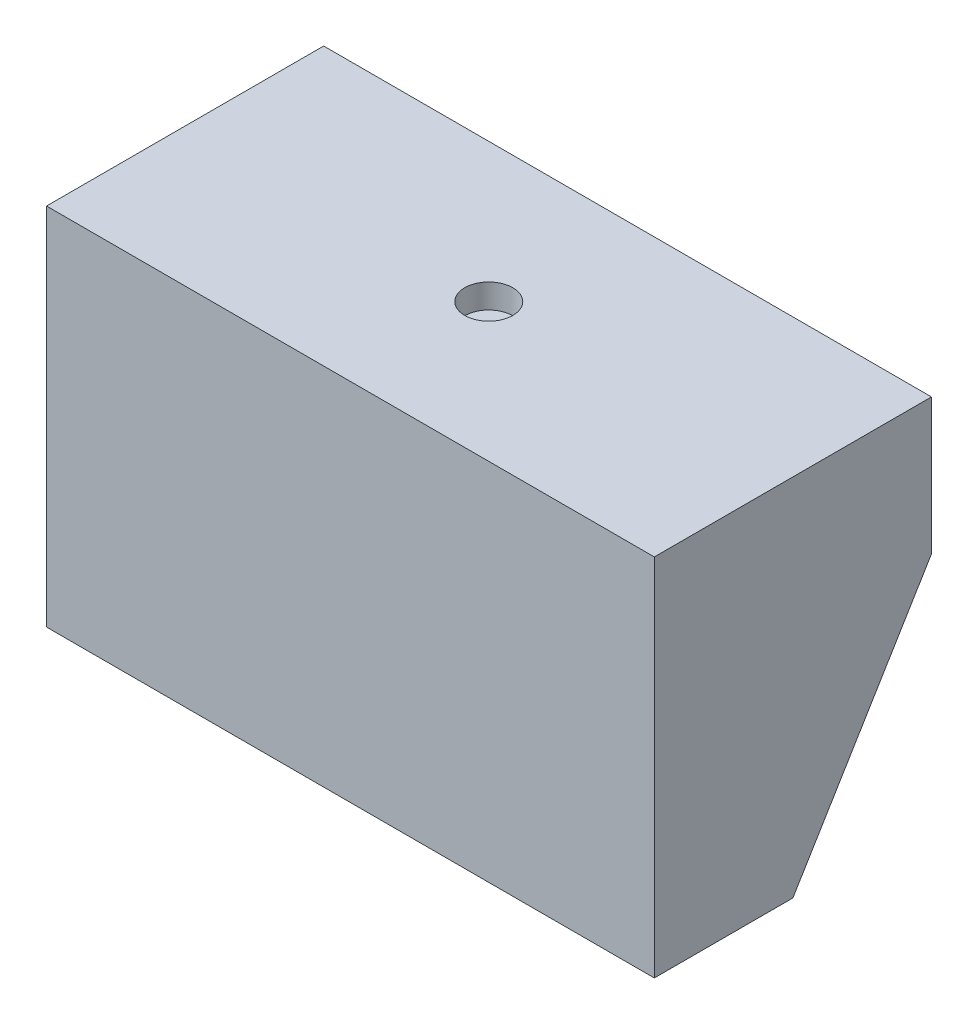
ISO-10303-21;
HEADER;
FILE_DESCRIPTION(('STEP AP214'),'2;1');
FILE_NAME('part.step','',(''),(''),'','','');
FILE_SCHEMA(('AUTOMOTIVE_DESIGN { 1 0 10303 214 1 1 1 1 }'));
ENDSEC;
DATA;
#1=APPLICATION_CONTEXT('core data for automotive mechanical design processes');
#2=APPLICATION_PROTOCOL_DEFINITION('international standard','automotive_design',2000,#1);
#3=PRODUCT_CONTEXT('',#1,'mechanical');
#4=PRODUCT('Part','Part','',(#3));
#5=PRODUCT_RELATED_PRODUCT_CATEGORY('part','',(#4));
#6=PRODUCT_DEFINITION_FORMATION('','',#4);
#7=PRODUCT_DEFINITION_CONTEXT('part definition',#1,'design');
#8=PRODUCT_DEFINITION('design','',#6,#7);
#9=PRODUCT_DEFINITION_SHAPE('','',#8);
#10=(LENGTH_UNIT() NAMED_UNIT(*) SI_UNIT(.MILLI.,.METRE.));
#11=(NAMED_UNIT(*) PLANE_ANGLE_UNIT() SI_UNIT($,.RADIAN.));
#12=(NAMED_UNIT(*) SI_UNIT($,.STERADIAN.) SOLID_ANGLE_UNIT());
#13=UNCERTAINTY_MEASURE_WITH_UNIT(LENGTH_MEASURE(1.E-05),#10,'distance_accuracy_value','');
#14=(GEOMETRIC_REPRESENTATION_CONTEXT(3) GLOBAL_UNCERTAINTY_ASSIGNED_CONTEXT((#13)) GLOBAL_UNIT_ASSIGNED_CONTEXT((#10,
#11,#12)) REPRESENTATION_CONTEXT('',''));
#15=CARTESIAN_POINT('',(0.,0.,0.));
#16=DIRECTION('',(0.,0.,1.));
#17=DIRECTION('',(1.,0.,0.));
#18=AXIS2_PLACEMENT_3D('',#15,#16,#17);
#19=CARTESIAN_POINT('',(125.,-75.,114.));
#20=DIRECTION('',(-1.,0.,0.));
#21=DIRECTION('',(0.,0.,1.));
#22=AXIS2_PLACEMENT_3D('',#19,#20,#21);
#23=PLANE('',#22);
#24=DIRECTION('',(0.,-0.855226725322334,0.518254038377355));
#25=VECTOR('',#24,1.);
#26=CARTESIAN_POINT('',(125.,-100.263808135213,72.3094731527829));
#27=LINE('',#26,#25);
#28=CARTESIAN_POINT('',(125.,19.0618301711685,0.));
#29=VERTEX_POINT('',#28);
#30=CARTESIAN_POINT('',(125.,-75.,56.9999999999999));
#31=VERTEX_POINT('',#30);
#32=EDGE_CURVE('E117',#29,#31,#27,.T.);
#33=ORIENTED_EDGE('',*,*,#32,.F.);
#34=DIRECTION('',(0.,1.,0.));
#35=VECTOR('',#34,1.);
#36=CARTESIAN_POINT('',(125.,-75.,0.));
#37=LINE('',#36,#35);
#38=CARTESIAN_POINT('',(125.,75.,0.));
#39=VERTEX_POINT('',#38);
#40=EDGE_CURVE('E125',#29,#39,#37,.T.);
#41=ORIENTED_EDGE('',*,*,#40,.T.);
#42=DIRECTION('',(0.,0.,-1.));
#43=VECTOR('',#42,1.);
#44=CARTESIAN_POINT('',(125.,75.,114.));
#45=LINE('',#44,#43);
#46=CARTESIAN_POINT('',(125.,75.,114.));
#47=VERTEX_POINT('',#46);
#48=EDGE_CURVE('E53',#47,#39,#45,.T.);
#49=ORIENTED_EDGE('',*,*,#48,.F.);
#50=DIRECTION('',(0.,1.,0.));
#51=VECTOR('',#50,1.);
#52=CARTESIAN_POINT('',(125.,-75.,114.));
#53=LINE('',#52,#51);
#54=CARTESIAN_POINT('',(125.,-75.,114.));
#55=VERTEX_POINT('',#54);
#56=EDGE_CURVE('E149',#55,#47,#53,.T.);
#57=ORIENTED_EDGE('',*,*,#56,.F.);
#58=DIRECTION('',(0.,0.,-1.));
#59=VECTOR('',#58,1.);
#60=CARTESIAN_POINT('',(125.,-75.,114.));
#61=LINE('',#60,#59);
#62=EDGE_CURVE('E128',#55,#31,#61,.T.);
#63=ORIENTED_EDGE('',*,*,#62,.T.);
#64=EDGE_LOOP('',(#33,#41,#49,#57,#63));
#65=FACE_BOUND('',#64,.T.);
#66=ADVANCED_FACE('F45',(#65),#23,.F.);
#67=CARTESIAN_POINT('',(-125.,-75.,114.));
#68=DIRECTION('',(0.,1.,0.));
#69=DIRECTION('',(0.,0.,1.));
#70=AXIS2_PLACEMENT_3D('',#67,#68,#69);
#71=PLANE('',#70);
#72=DIRECTION('',(-0.823397266330031,0.,-0.567465366168044));
#73=VECTOR('',#72,1.);
#74=CARTESIAN_POINT('',(-17.862546969277,-75.,-41.4573921273211));
#75=LINE('',#74,#73);
#76=CARTESIAN_POINT('',(42.292495755744,-75.,0.));
#77=VERTEX_POINT('',#76);
#78=EDGE_CURVE('E64',#31,#77,#75,.T.);
#79=ORIENTED_EDGE('',*,*,#78,.F.);
#80=ORIENTED_EDGE('',*,*,#62,.F.);
#81=DIRECTION('',(1.,0.,0.));
#82=VECTOR('',#81,1.);
#83=CARTESIAN_POINT('',(-125.,-75.,114.));
#84=LINE('',#83,#82);
#85=CARTESIAN_POINT('',(-125.,-75.,114.));
#86=VERTEX_POINT('',#85);
#87=EDGE_CURVE('E74',#86,#55,#84,.T.);
#88=ORIENTED_EDGE('',*,*,#87,.F.);
#89=DIRECTION('',(0.,0.,-1.));
#90=VECTOR('',#89,1.);
#91=CARTESIAN_POINT('',(-125.,-75.,114.));
#92=LINE('',#91,#90);
#93=CARTESIAN_POINT('',(-125.,-75.,0.));
#94=VERTEX_POINT('',#93);
#95=EDGE_CURVE('E152',#86,#94,#92,.T.);
#96=ORIENTED_EDGE('',*,*,#95,.T.);
#97=DIRECTION('',(1.,0.,0.));
#98=VECTOR('',#97,1.);
#99=CARTESIAN_POINT('',(-125.,-75.,0.));
#100=LINE('',#99,#98);
#101=EDGE_CURVE('E146',#94,#77,#100,.T.);
#102=ORIENTED_EDGE('',*,*,#101,.T.);
#103=EDGE_LOOP('',(#79,#80,#88,#96,#102));
#104=FACE_BOUND('',#103,.T.);
#105=ADVANCED_FACE('F229',(#104),#71,.F.);
#106=CARTESIAN_POINT('',(0.,0.,0.));
#107=DIRECTION('',(0.,0.,-1.));
#108=DIRECTION('',(-1.,0.,0.));
#109=AXIS2_PLACEMENT_3D('',#106,#107,#108);
#110=PLANE('',#109);
#111=ORIENTED_EDGE('',*,*,#40,.F.);
#112=DIRECTION('',(-0.66032679808164,-0.750978375011724,0.));
#113=VECTOR('',#112,1.);
#114=CARTESIAN_POINT('',(61.0434721622796,-53.6748351989157,0.));
#115=LINE('',#114,#113);
#116=EDGE_CURVE('E11',#29,#77,#115,.T.);
#117=ORIENTED_EDGE('',*,*,#116,.T.);
#118=ORIENTED_EDGE('',*,*,#101,.F.);
#119=DIRECTION('',(0.,-1.,0.));
#120=VECTOR('',#119,1.);
#121=CARTESIAN_POINT('',(-125.,-75.,0.));
#122=LINE('',#121,#120);
#123=CARTESIAN_POINT('',(-125.,75.,0.));
#124=VERTEX_POINT('',#123);
#125=EDGE_CURVE('E98',#124,#94,#122,.T.);
#126=ORIENTED_EDGE('',*,*,#125,.F.);
#127=DIRECTION('',(-1.,0.,0.));
#128=VECTOR('',#127,1.);
#129=CARTESIAN_POINT('',(-125.,75.,0.));
#130=LINE('',#129,#128);
#131=EDGE_CURVE('E132',#39,#124,#130,.T.);
#132=ORIENTED_EDGE('',*,*,#131,.F.);
#133=EDGE_LOOP('',(#111,#117,#118,#126,#132));
#134=FACE_BOUND('',#133,.T.);
#135=ADVANCED_FACE('F131',(#134),#110,.T.);
#136=CARTESIAN_POINT('',(-125.,75.,114.));
#137=DIRECTION('',(0.,-1.,0.));
#138=DIRECTION('',(0.,0.,-1.));
#139=AXIS2_PLACEMENT_3D('',#136,#137,#138);
#140=PLANE('',#139);
#141=CARTESIAN_POINT('',(0.,75.,57.0925226692225));
#142=DIRECTION('',(0.,1.,0.));
#143=DIRECTION('',(0.,0.,1.));
#144=AXIS2_PLACEMENT_3D('',#141,#142,#143);
#145=CIRCLE('',#144,9.89484920947829);
#146=CARTESIAN_POINT('',(0.,75.,66.9873718787008));
#147=VERTEX_POINT('',#146);
#148=EDGE_CURVE('E211',#147,#147,#145,.T.);
#149=ORIENTED_EDGE('',*,*,#148,.F.);
#150=EDGE_LOOP('',(#149));
#151=FACE_BOUND('',#150,.T.);
#152=ORIENTED_EDGE('',*,*,#131,.T.);
#153=DIRECTION('',(0.,0.,-1.));
#154=VECTOR('',#153,1.);
#155=CARTESIAN_POINT('',(-125.,75.,114.));
#156=LINE('',#155,#154);
#157=CARTESIAN_POINT('',(-125.,75.,114.));
#158=VERTEX_POINT('',#157);
#159=EDGE_CURVE('E155',#158,#124,#156,.T.);
#160=ORIENTED_EDGE('',*,*,#159,.F.);
#161=DIRECTION('',(-1.,0.,0.));
#162=VECTOR('',#161,1.);
#163=CARTESIAN_POINT('',(-125.,75.,114.));
#164=LINE('',#163,#162);
#165=EDGE_CURVE('E108',#47,#158,#164,.T.);
#166=ORIENTED_EDGE('',*,*,#165,.F.);
#167=ORIENTED_EDGE('',*,*,#48,.T.);
#168=EDGE_LOOP('',(#152,#160,#166,#167));
#169=FACE_BOUND('',#168,.T.);
#170=ADVANCED_FACE('F162',(#151,#169),#140,.F.);
#171=CARTESIAN_POINT('',(-125.,-75.,114.));
#172=DIRECTION('',(1.,0.,0.));
#173=DIRECTION('',(0.,0.,-1.));
#174=AXIS2_PLACEMENT_3D('',#171,#172,#173);
#175=PLANE('',#174);
#176=ORIENTED_EDGE('',*,*,#125,.T.);
#177=ORIENTED_EDGE('',*,*,#95,.F.);
#178=DIRECTION('',(0.,-1.,0.));
#179=VECTOR('',#178,1.);
#180=CARTESIAN_POINT('',(-125.,-75.,114.));
#181=LINE('',#180,#179);
#182=EDGE_CURVE('E168',#158,#86,#181,.T.);
#183=ORIENTED_EDGE('',*,*,#182,.F.);
#184=ORIENTED_EDGE('',*,*,#159,.T.);
#185=EDGE_LOOP('',(#176,#177,#183,#184));
#186=FACE_BOUND('',#185,.T.);
#187=ADVANCED_FACE('F220',(#186),#175,.F.);
#188=CARTESIAN_POINT('',(0.,0.,114.));
#189=DIRECTION('',(0.,0.,-1.));
#190=DIRECTION('',(-1.,0.,0.));
#191=AXIS2_PLACEMENT_3D('',#188,#189,#190);
#192=PLANE('',#191);
#193=ORIENTED_EDGE('',*,*,#56,.T.);
#194=ORIENTED_EDGE('',*,*,#165,.T.);
#195=ORIENTED_EDGE('',*,*,#182,.T.);
#196=ORIENTED_EDGE('',*,*,#87,.T.);
#197=EDGE_LOOP('',(#193,#194,#195,#196));
#198=FACE_BOUND('',#197,.T.);
#199=ADVANCED_FACE('F226',(#198),#192,.F.);
#200=CARTESIAN_POINT('',(27.9069349234818,-24.5382524923008,-40.4932094496149));
#201=DIRECTION('',(0.507766315458884,-0.446473182740372,-0.736773415629929));
#202=DIRECTION('',(-0.823397266330031,0.,-0.567465366168044));
#203=AXIS2_PLACEMENT_3D('',#200,#201,#202);
#204=PLANE('',#203);
#205=ORIENTED_EDGE('',*,*,#32,.T.);
#206=ORIENTED_EDGE('',*,*,#78,.T.);
#207=ORIENTED_EDGE('',*,*,#116,.F.);
#208=EDGE_LOOP('',(#205,#206,#207));
#209=FACE_BOUND('',#208,.T.);
#210=ADVANCED_FACE('F116',(#209),#204,.T.);
#211=CARTESIAN_POINT('',(0.,65.,57.0925226692225));
#212=DIRECTION('',(0.,1.,0.));
#213=DIRECTION('',(0.,0.,1.));
#214=AXIS2_PLACEMENT_3D('',#211,#212,#213);
#215=CYLINDRICAL_SURFACE('',#214,9.89484920947829);
#216=CARTESIAN_POINT('',(0.,65.,57.0925226692225));
#217=DIRECTION('',(0.,1.,0.));
#218=DIRECTION('',(0.,0.,1.));
#219=AXIS2_PLACEMENT_3D('',#216,#217,#218);
#220=CIRCLE('',#219,9.89484920947829);
#221=CARTESIAN_POINT('',(0.,65.,66.9873718787008));
#222=VERTEX_POINT('',#221);
#223=EDGE_CURVE('E207',#222,#222,#220,.T.);
#224=ORIENTED_EDGE('',*,*,#223,.F.);
#225=EDGE_LOOP('',(#224));
#226=FACE_BOUND('',#225,.T.);
#227=ORIENTED_EDGE('',*,*,#148,.T.);
#228=EDGE_LOOP('',(#227));
#229=FACE_BOUND('',#228,.T.);
#230=ADVANCED_FACE('F217',(#226,#229),#215,.F.);
#231=CARTESIAN_POINT('',(0.,65.,57.0925226692225));
#232=DIRECTION('',(0.,1.,0.));
#233=DIRECTION('',(0.,0.,1.));
#234=AXIS2_PLACEMENT_3D('',#231,#232,#233);
#235=PLANE('',#234);
#236=ORIENTED_EDGE('',*,*,#223,.T.);
#237=EDGE_LOOP('',(#236));
#238=FACE_BOUND('',#237,.T.);
#239=ADVANCED_FACE('F246',(#238),#235,.T.);
#240=CLOSED_SHELL('',(#66,#105,#135,#170,#187,#199,#210,#230,#239));
#241=MANIFOLD_SOLID_BREP('B2',#240);
#242=ADVANCED_BREP_SHAPE_REPRESENTATION('',(#18,#241),#14);
#243=SHAPE_DEFINITION_REPRESENTATION(#9,#242);
ENDSEC;
END-ISO-10303-21;
